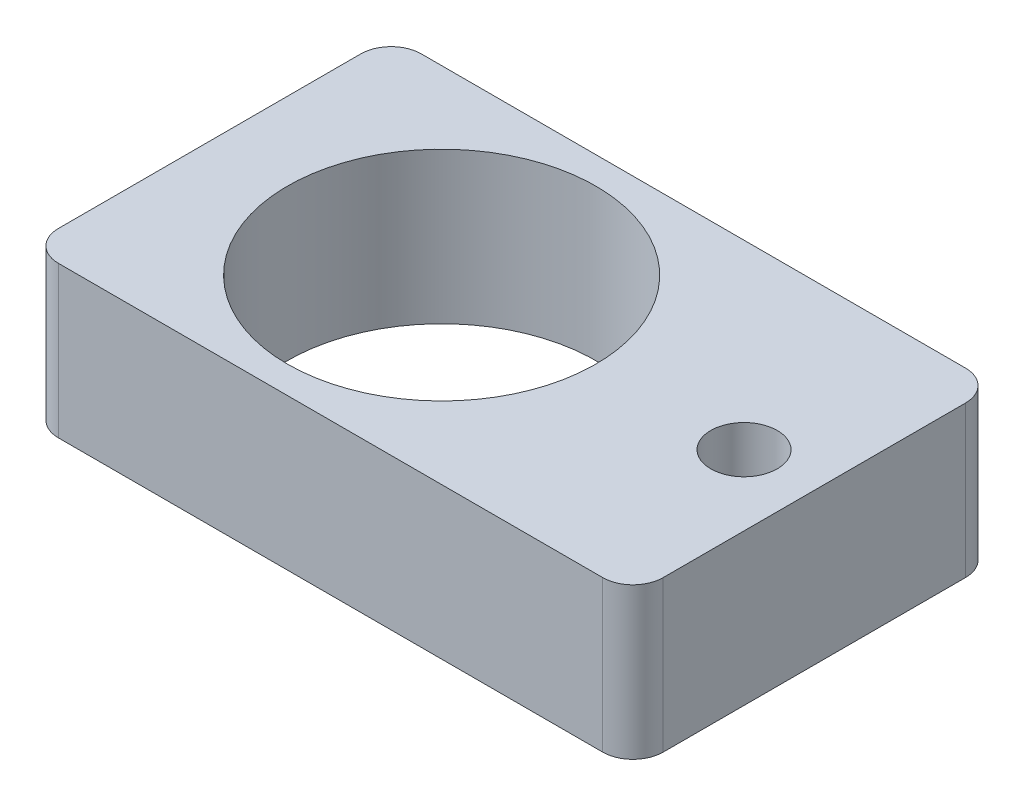
ISO-10303-21;
HEADER;
FILE_DESCRIPTION(('STEP AP214'),'2;1');
FILE_NAME('part.step','',(''),(''),'','','');
FILE_SCHEMA(('AUTOMOTIVE_DESIGN { 1 0 10303 214 1 1 1 1 }'));
ENDSEC;
DATA;
#1=APPLICATION_CONTEXT('core data for automotive mechanical design processes');
#2=APPLICATION_PROTOCOL_DEFINITION('international standard','automotive_design',2000,#1);
#3=PRODUCT_CONTEXT('',#1,'mechanical');
#4=PRODUCT('Part','Part','',(#3));
#5=PRODUCT_RELATED_PRODUCT_CATEGORY('part','',(#4));
#6=PRODUCT_DEFINITION_FORMATION('','',#4);
#7=PRODUCT_DEFINITION_CONTEXT('part definition',#1,'design');
#8=PRODUCT_DEFINITION('design','',#6,#7);
#9=PRODUCT_DEFINITION_SHAPE('','',#8);
#10=(LENGTH_UNIT() NAMED_UNIT(*) SI_UNIT(.MILLI.,.METRE.));
#11=(NAMED_UNIT(*) PLANE_ANGLE_UNIT() SI_UNIT($,.RADIAN.));
#12=(NAMED_UNIT(*) SI_UNIT($,.STERADIAN.) SOLID_ANGLE_UNIT());
#13=UNCERTAINTY_MEASURE_WITH_UNIT(LENGTH_MEASURE(1.E-05),#10,'distance_accuracy_value','');
#14=(GEOMETRIC_REPRESENTATION_CONTEXT(3) GLOBAL_UNCERTAINTY_ASSIGNED_CONTEXT((#13)) GLOBAL_UNIT_ASSIGNED_CONTEXT((#10,
#11,#12)) REPRESENTATION_CONTEXT('',''));
#15=CARTESIAN_POINT('',(0.,0.,0.));
#16=DIRECTION('',(0.,0.,1.));
#17=DIRECTION('',(1.,0.,0.));
#18=AXIS2_PLACEMENT_3D('',#15,#16,#17);
#19=CARTESIAN_POINT('',(0.,5.,0.));
#20=DIRECTION('',(0.,-1.,0.));
#21=DIRECTION('',(0.,0.,-1.));
#22=AXIS2_PLACEMENT_3D('',#19,#20,#21);
#23=PLANE('',#22);
#24=DIRECTION('',(1.,0.,0.));
#25=VECTOR('',#24,1.);
#26=CARTESIAN_POINT('',(-10.,5.,6.));
#27=LINE('',#26,#25);
#28=CARTESIAN_POINT('',(-9.,5.,6.));
#29=VERTEX_POINT('',#28);
#30=CARTESIAN_POINT('',(9.,5.,6.));
#31=VERTEX_POINT('',#30);
#32=EDGE_CURVE('E168',#29,#31,#27,.T.);
#33=ORIENTED_EDGE('',*,*,#32,.T.);
#34=CARTESIAN_POINT('',(9.00000000000001,5.,5.));
#35=DIRECTION('',(0.,-1.,0.));
#36=DIRECTION('',(0.,0.,-1.));
#37=AXIS2_PLACEMENT_3D('',#34,#35,#36);
#38=CIRCLE('',#37,1.);
#39=CARTESIAN_POINT('',(10.,5.,5.));
#40=VERTEX_POINT('',#39);
#41=EDGE_CURVE('E149',#31,#40,#38,.F.);
#42=ORIENTED_EDGE('',*,*,#41,.T.);
#43=DIRECTION('',(0.,0.,-1.));
#44=VECTOR('',#43,1.);
#45=CARTESIAN_POINT('',(10.,5.,6.));
#46=LINE('',#45,#44);
#47=CARTESIAN_POINT('',(10.,5.,-5.));
#48=VERTEX_POINT('',#47);
#49=EDGE_CURVE('E119',#40,#48,#46,.T.);
#50=ORIENTED_EDGE('',*,*,#49,.T.);
#51=CARTESIAN_POINT('',(9.,5.,-5.));
#52=DIRECTION('',(0.,-1.,0.));
#53=DIRECTION('',(0.,0.,-1.));
#54=AXIS2_PLACEMENT_3D('',#51,#52,#53);
#55=CIRCLE('',#54,1.);
#56=CARTESIAN_POINT('',(9.,5.,-6.));
#57=VERTEX_POINT('',#56);
#58=EDGE_CURVE('E55',#48,#57,#55,.F.);
#59=ORIENTED_EDGE('',*,*,#58,.T.);
#60=DIRECTION('',(-1.,0.,0.));
#61=VECTOR('',#60,1.);
#62=CARTESIAN_POINT('',(-10.,5.,-6.));
#63=LINE('',#62,#61);
#64=CARTESIAN_POINT('',(-9.,5.,-6.));
#65=VERTEX_POINT('',#64);
#66=EDGE_CURVE('E135',#57,#65,#63,.T.);
#67=ORIENTED_EDGE('',*,*,#66,.T.);
#68=CARTESIAN_POINT('',(-9.,5.,-5.));
#69=DIRECTION('',(0.,-1.,0.));
#70=DIRECTION('',(0.,0.,-1.));
#71=AXIS2_PLACEMENT_3D('',#68,#69,#70);
#72=CIRCLE('',#71,1.);
#73=CARTESIAN_POINT('',(-10.,5.,-5.));
#74=VERTEX_POINT('',#73);
#75=EDGE_CURVE('E146',#65,#74,#72,.F.);
#76=ORIENTED_EDGE('',*,*,#75,.T.);
#77=DIRECTION('',(0.,0.,1.));
#78=VECTOR('',#77,1.);
#79=CARTESIAN_POINT('',(-10.,5.,6.));
#80=LINE('',#79,#78);
#81=CARTESIAN_POINT('',(-10.,5.,5.));
#82=VERTEX_POINT('',#81);
#83=EDGE_CURVE('E129',#74,#82,#80,.T.);
#84=ORIENTED_EDGE('',*,*,#83,.T.);
#85=CARTESIAN_POINT('',(-9.,5.,5.));
#86=DIRECTION('',(0.,-1.,0.));
#87=DIRECTION('',(0.,0.,-1.));
#88=AXIS2_PLACEMENT_3D('',#85,#86,#87);
#89=CIRCLE('',#88,1.);
#90=EDGE_CURVE('E144',#82,#29,#89,.F.);
#91=ORIENTED_EDGE('',*,*,#90,.T.);
#92=EDGE_LOOP('',(#33,#42,#50,#59,#67,#76,#84,#91));
#93=FACE_BOUND('',#92,.T.);
#94=CARTESIAN_POINT('',(-2.32697533959188,5.,0.));
#95=DIRECTION('',(0.,1.,0.));
#96=DIRECTION('',(0.,0.,1.));
#97=AXIS2_PLACEMENT_3D('',#94,#95,#96);
#98=CIRCLE('',#97,5.1);
#99=CARTESIAN_POINT('',(-2.32697533959188,5.,5.1));
#100=VERTEX_POINT('',#99);
#101=EDGE_CURVE('E173',#100,#100,#98,.T.);
#102=ORIENTED_EDGE('',*,*,#101,.F.);
#103=EDGE_LOOP('',(#102));
#104=FACE_BOUND('',#103,.T.);
#105=CARTESIAN_POINT('',(7.67302466040812,5.,0.));
#106=DIRECTION('',(0.,1.,0.));
#107=DIRECTION('',(0.,0.,1.));
#108=AXIS2_PLACEMENT_3D('',#105,#106,#107);
#109=CIRCLE('',#108,1.1);
#110=CARTESIAN_POINT('',(7.67302466040812,5.,1.1));
#111=VERTEX_POINT('',#110);
#112=EDGE_CURVE('E182',#111,#111,#109,.T.);
#113=ORIENTED_EDGE('',*,*,#112,.F.);
#114=EDGE_LOOP('',(#113));
#115=FACE_BOUND('',#114,.T.);
#116=ADVANCED_FACE('F33',(#93,#104,#115),#23,.F.);
#117=CARTESIAN_POINT('',(0.,0.,0.));
#118=DIRECTION('',(0.,-1.,0.));
#119=DIRECTION('',(0.,0.,-1.));
#120=AXIS2_PLACEMENT_3D('',#117,#118,#119);
#121=PLANE('',#120);
#122=CARTESIAN_POINT('',(-2.32697533959188,0.,0.));
#123=DIRECTION('',(0.,1.,0.));
#124=DIRECTION('',(0.,0.,1.));
#125=AXIS2_PLACEMENT_3D('',#122,#123,#124);
#126=CIRCLE('',#125,5.1);
#127=CARTESIAN_POINT('',(-2.32697533959188,0.,5.1));
#128=VERTEX_POINT('',#127);
#129=EDGE_CURVE('E175',#128,#128,#126,.T.);
#130=ORIENTED_EDGE('',*,*,#129,.T.);
#131=EDGE_LOOP('',(#130));
#132=FACE_BOUND('',#131,.T.);
#133=DIRECTION('',(0.,0.,-1.));
#134=VECTOR('',#133,1.);
#135=CARTESIAN_POINT('',(10.,0.,6.));
#136=LINE('',#135,#134);
#137=CARTESIAN_POINT('',(10.,0.,5.));
#138=VERTEX_POINT('',#137);
#139=CARTESIAN_POINT('',(10.,0.,-5.));
#140=VERTEX_POINT('',#139);
#141=EDGE_CURVE('E117',#138,#140,#136,.T.);
#142=ORIENTED_EDGE('',*,*,#141,.F.);
#143=CARTESIAN_POINT('',(9.00000000000001,0.,5.));
#144=DIRECTION('',(0.,-1.,0.));
#145=DIRECTION('',(0.,0.,-1.));
#146=AXIS2_PLACEMENT_3D('',#143,#144,#145);
#147=CIRCLE('',#146,1.);
#148=CARTESIAN_POINT('',(9.,0.,6.));
#149=VERTEX_POINT('',#148);
#150=EDGE_CURVE('E100',#138,#149,#147,.T.);
#151=ORIENTED_EDGE('',*,*,#150,.T.);
#152=DIRECTION('',(1.,0.,0.));
#153=VECTOR('',#152,1.);
#154=CARTESIAN_POINT('',(-10.,0.,6.));
#155=LINE('',#154,#153);
#156=CARTESIAN_POINT('',(-9.,0.,6.));
#157=VERTEX_POINT('',#156);
#158=EDGE_CURVE('E127',#157,#149,#155,.T.);
#159=ORIENTED_EDGE('',*,*,#158,.F.);
#160=CARTESIAN_POINT('',(-9.,0.,5.));
#161=DIRECTION('',(0.,-1.,0.));
#162=DIRECTION('',(0.,0.,-1.));
#163=AXIS2_PLACEMENT_3D('',#160,#161,#162);
#164=CIRCLE('',#163,1.);
#165=CARTESIAN_POINT('',(-10.,0.,5.));
#166=VERTEX_POINT('',#165);
#167=EDGE_CURVE('E120',#157,#166,#164,.T.);
#168=ORIENTED_EDGE('',*,*,#167,.T.);
#169=DIRECTION('',(0.,0.,1.));
#170=VECTOR('',#169,1.);
#171=CARTESIAN_POINT('',(-10.,0.,6.));
#172=LINE('',#171,#170);
#173=CARTESIAN_POINT('',(-10.,0.,-5.));
#174=VERTEX_POINT('',#173);
#175=EDGE_CURVE('E131',#174,#166,#172,.T.);
#176=ORIENTED_EDGE('',*,*,#175,.F.);
#177=CARTESIAN_POINT('',(-9.,0.,-5.));
#178=DIRECTION('',(0.,-1.,0.));
#179=DIRECTION('',(0.,0.,-1.));
#180=AXIS2_PLACEMENT_3D('',#177,#178,#179);
#181=CIRCLE('',#180,1.);
#182=CARTESIAN_POINT('',(-9.,0.,-6.));
#183=VERTEX_POINT('',#182);
#184=EDGE_CURVE('E138',#174,#183,#181,.T.);
#185=ORIENTED_EDGE('',*,*,#184,.T.);
#186=DIRECTION('',(-1.,0.,0.));
#187=VECTOR('',#186,1.);
#188=CARTESIAN_POINT('',(-10.,0.,-6.));
#189=LINE('',#188,#187);
#190=CARTESIAN_POINT('',(9.,0.,-6.));
#191=VERTEX_POINT('',#190);
#192=EDGE_CURVE('E126',#191,#183,#189,.T.);
#193=ORIENTED_EDGE('',*,*,#192,.F.);
#194=CARTESIAN_POINT('',(9.,0.,-5.));
#195=DIRECTION('',(0.,-1.,0.));
#196=DIRECTION('',(0.,0.,-1.));
#197=AXIS2_PLACEMENT_3D('',#194,#195,#196);
#198=CIRCLE('',#197,1.);
#199=EDGE_CURVE('E111',#191,#140,#198,.T.);
#200=ORIENTED_EDGE('',*,*,#199,.T.);
#201=EDGE_LOOP('',(#142,#151,#159,#168,#176,#185,#193,#200));
#202=FACE_BOUND('',#201,.T.);
#203=CARTESIAN_POINT('',(7.67302466040812,0.,0.));
#204=DIRECTION('',(0.,1.,0.));
#205=DIRECTION('',(0.,0.,1.));
#206=AXIS2_PLACEMENT_3D('',#203,#204,#205);
#207=CIRCLE('',#206,1.1);
#208=CARTESIAN_POINT('',(7.67302466040812,0.,1.1));
#209=VERTEX_POINT('',#208);
#210=EDGE_CURVE('E184',#209,#209,#207,.T.);
#211=ORIENTED_EDGE('',*,*,#210,.T.);
#212=EDGE_LOOP('',(#211));
#213=FACE_BOUND('',#212,.T.);
#214=ADVANCED_FACE('F123',(#132,#202,#213),#121,.T.);
#215=CARTESIAN_POINT('',(-10.,5.,6.));
#216=DIRECTION('',(1.,0.,0.));
#217=DIRECTION('',(0.,0.,-1.));
#218=AXIS2_PLACEMENT_3D('',#215,#216,#217);
#219=PLANE('',#218);
#220=ORIENTED_EDGE('',*,*,#83,.F.);
#221=DIRECTION('',(0.,-1.,0.));
#222=VECTOR('',#221,1.);
#223=CARTESIAN_POINT('',(-10.,5.,-5.));
#224=LINE('',#223,#222);
#225=EDGE_CURVE('E11',#74,#174,#224,.T.);
#226=ORIENTED_EDGE('',*,*,#225,.T.);
#227=ORIENTED_EDGE('',*,*,#175,.T.);
#228=DIRECTION('',(0.,-1.,0.));
#229=VECTOR('',#228,1.);
#230=CARTESIAN_POINT('',(-10.,5.,5.));
#231=LINE('',#230,#229);
#232=EDGE_CURVE('E41',#166,#82,#231,.F.);
#233=ORIENTED_EDGE('',*,*,#232,.T.);
#234=EDGE_LOOP('',(#220,#226,#227,#233));
#235=FACE_BOUND('',#234,.T.);
#236=ADVANCED_FACE('F159',(#235),#219,.F.);
#237=CARTESIAN_POINT('',(-10.,5.,6.));
#238=DIRECTION('',(0.,0.,-1.));
#239=DIRECTION('',(-1.,0.,0.));
#240=AXIS2_PLACEMENT_3D('',#237,#238,#239);
#241=PLANE('',#240);
#242=ORIENTED_EDGE('',*,*,#158,.T.);
#243=DIRECTION('',(0.,-1.,0.));
#244=VECTOR('',#243,1.);
#245=CARTESIAN_POINT('',(9.00000000000001,5.,6.));
#246=LINE('',#245,#244);
#247=EDGE_CURVE('E105',#149,#31,#246,.F.);
#248=ORIENTED_EDGE('',*,*,#247,.T.);
#249=ORIENTED_EDGE('',*,*,#32,.F.);
#250=DIRECTION('',(0.,-1.,0.));
#251=VECTOR('',#250,1.);
#252=CARTESIAN_POINT('',(-9.,5.,6.));
#253=LINE('',#252,#251);
#254=EDGE_CURVE('E110',#29,#157,#253,.T.);
#255=ORIENTED_EDGE('',*,*,#254,.T.);
#256=EDGE_LOOP('',(#242,#248,#249,#255));
#257=FACE_BOUND('',#256,.T.);
#258=ADVANCED_FACE('F172',(#257),#241,.F.);
#259=CARTESIAN_POINT('',(10.,5.,6.));
#260=DIRECTION('',(-1.,0.,0.));
#261=DIRECTION('',(0.,0.,1.));
#262=AXIS2_PLACEMENT_3D('',#259,#260,#261);
#263=PLANE('',#262);
#264=ORIENTED_EDGE('',*,*,#49,.F.);
#265=DIRECTION('',(0.,-1.,0.));
#266=VECTOR('',#265,1.);
#267=CARTESIAN_POINT('',(10.,5.,5.));
#268=LINE('',#267,#266);
#269=EDGE_CURVE('E104',#40,#138,#268,.T.);
#270=ORIENTED_EDGE('',*,*,#269,.T.);
#271=ORIENTED_EDGE('',*,*,#141,.T.);
#272=DIRECTION('',(0.,-1.,0.));
#273=VECTOR('',#272,1.);
#274=CARTESIAN_POINT('',(10.,5.,-5.));
#275=LINE('',#274,#273);
#276=EDGE_CURVE('E121',#140,#48,#275,.F.);
#277=ORIENTED_EDGE('',*,*,#276,.T.);
#278=EDGE_LOOP('',(#264,#270,#271,#277));
#279=FACE_BOUND('',#278,.T.);
#280=ADVANCED_FACE('F116',(#279),#263,.F.);
#281=CARTESIAN_POINT('',(-10.,5.,-6.));
#282=DIRECTION('',(0.,0.,1.));
#283=DIRECTION('',(1.,0.,0.));
#284=AXIS2_PLACEMENT_3D('',#281,#282,#283);
#285=PLANE('',#284);
#286=ORIENTED_EDGE('',*,*,#66,.F.);
#287=DIRECTION('',(0.,-1.,0.));
#288=VECTOR('',#287,1.);
#289=CARTESIAN_POINT('',(9.,5.,-6.));
#290=LINE('',#289,#288);
#291=EDGE_CURVE('E152',#57,#191,#290,.T.);
#292=ORIENTED_EDGE('',*,*,#291,.T.);
#293=ORIENTED_EDGE('',*,*,#192,.T.);
#294=DIRECTION('',(0.,-1.,0.));
#295=VECTOR('',#294,1.);
#296=CARTESIAN_POINT('',(-9.,5.,-6.));
#297=LINE('',#296,#295);
#298=EDGE_CURVE('E48',#183,#65,#297,.F.);
#299=ORIENTED_EDGE('',*,*,#298,.T.);
#300=EDGE_LOOP('',(#286,#292,#293,#299));
#301=FACE_BOUND('',#300,.T.);
#302=ADVANCED_FACE('F204',(#301),#285,.F.);
#303=CARTESIAN_POINT('',(-2.32697533959188,5.,0.));
#304=DIRECTION('',(0.,-1.,0.));
#305=DIRECTION('',(0.,0.,-1.));
#306=AXIS2_PLACEMENT_3D('',#303,#304,#305);
#307=CYLINDRICAL_SURFACE('',#306,5.1);
#308=ORIENTED_EDGE('',*,*,#101,.T.);
#309=EDGE_LOOP('',(#308));
#310=FACE_BOUND('',#309,.T.);
#311=ORIENTED_EDGE('',*,*,#129,.F.);
#312=EDGE_LOOP('',(#311));
#313=FACE_BOUND('',#312,.T.);
#314=ADVANCED_FACE('F201',(#310,#313),#307,.F.);
#315=CARTESIAN_POINT('',(7.67302466040812,5.,0.));
#316=DIRECTION('',(0.,-1.,0.));
#317=DIRECTION('',(0.,0.,-1.));
#318=AXIS2_PLACEMENT_3D('',#315,#316,#317);
#319=CYLINDRICAL_SURFACE('',#318,1.1);
#320=ORIENTED_EDGE('',*,*,#112,.T.);
#321=EDGE_LOOP('',(#320));
#322=FACE_BOUND('',#321,.T.);
#323=ORIENTED_EDGE('',*,*,#210,.F.);
#324=EDGE_LOOP('',(#323));
#325=FACE_BOUND('',#324,.T.);
#326=ADVANCED_FACE('F190',(#322,#325),#319,.F.);
#327=CARTESIAN_POINT('',(9.00000000000001,5.,5.));
#328=DIRECTION('',(0.,-1.,0.));
#329=DIRECTION('',(0.,0.,-1.));
#330=AXIS2_PLACEMENT_3D('',#327,#328,#329);
#331=CYLINDRICAL_SURFACE('',#330,1.);
#332=ORIENTED_EDGE('',*,*,#41,.F.);
#333=ORIENTED_EDGE('',*,*,#247,.F.);
#334=ORIENTED_EDGE('',*,*,#150,.F.);
#335=ORIENTED_EDGE('',*,*,#269,.F.);
#336=EDGE_LOOP('',(#332,#333,#334,#335));
#337=FACE_BOUND('',#336,.T.);
#338=ADVANCED_FACE('F103',(#337),#331,.T.);
#339=CARTESIAN_POINT('',(9.,5.,-5.));
#340=DIRECTION('',(0.,-1.,0.));
#341=DIRECTION('',(0.,0.,-1.));
#342=AXIS2_PLACEMENT_3D('',#339,#340,#341);
#343=CYLINDRICAL_SURFACE('',#342,1.);
#344=ORIENTED_EDGE('',*,*,#58,.F.);
#345=ORIENTED_EDGE('',*,*,#276,.F.);
#346=ORIENTED_EDGE('',*,*,#199,.F.);
#347=ORIENTED_EDGE('',*,*,#291,.F.);
#348=EDGE_LOOP('',(#344,#345,#346,#347));
#349=FACE_BOUND('',#348,.T.);
#350=ADVANCED_FACE('F215',(#349),#343,.T.);
#351=CARTESIAN_POINT('',(-9.,5.,-5.));
#352=DIRECTION('',(0.,-1.,0.));
#353=DIRECTION('',(0.,0.,-1.));
#354=AXIS2_PLACEMENT_3D('',#351,#352,#353);
#355=CYLINDRICAL_SURFACE('',#354,1.);
#356=ORIENTED_EDGE('',*,*,#75,.F.);
#357=ORIENTED_EDGE('',*,*,#298,.F.);
#358=ORIENTED_EDGE('',*,*,#184,.F.);
#359=ORIENTED_EDGE('',*,*,#225,.F.);
#360=EDGE_LOOP('',(#356,#357,#358,#359));
#361=FACE_BOUND('',#360,.T.);
#362=ADVANCED_FACE('F217',(#361),#355,.T.);
#363=CARTESIAN_POINT('',(-9.,5.,5.));
#364=DIRECTION('',(0.,-1.,0.));
#365=DIRECTION('',(0.,0.,-1.));
#366=AXIS2_PLACEMENT_3D('',#363,#364,#365);
#367=CYLINDRICAL_SURFACE('',#366,1.);
#368=ORIENTED_EDGE('',*,*,#90,.F.);
#369=ORIENTED_EDGE('',*,*,#232,.F.);
#370=ORIENTED_EDGE('',*,*,#167,.F.);
#371=ORIENTED_EDGE('',*,*,#254,.F.);
#372=EDGE_LOOP('',(#368,#369,#370,#371));
#373=FACE_BOUND('',#372,.T.);
#374=ADVANCED_FACE('F35',(#373),#367,.T.);
#375=CLOSED_SHELL('',(#116,#214,#236,#258,#280,#302,#314,#326,#338,#350,#362,#374));
#376=MANIFOLD_SOLID_BREP('B2',#375);
#377=ADVANCED_BREP_SHAPE_REPRESENTATION('',(#18,#376),#14);
#378=SHAPE_DEFINITION_REPRESENTATION(#9,#377);
ENDSEC;
END-ISO-10303-21;
